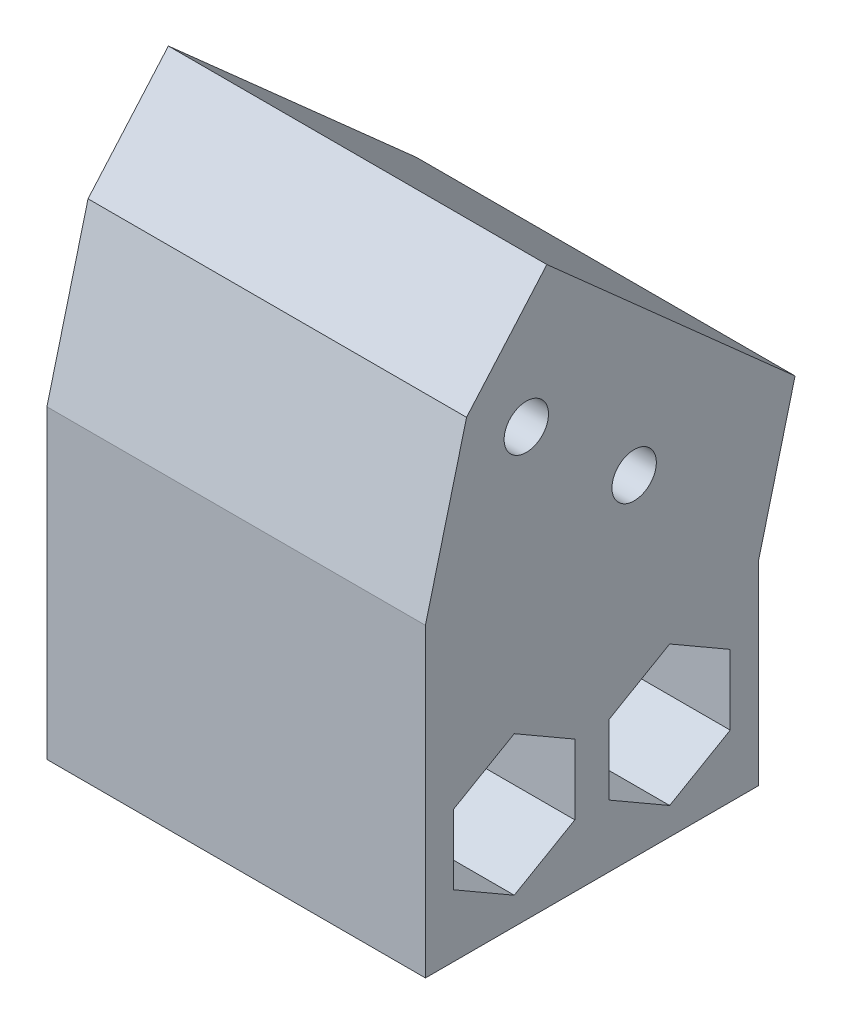
ISO-10303-21;
HEADER;
FILE_DESCRIPTION(('STEP AP214'),'2;1');
FILE_NAME('part.step','',(''),(''),'','','');
FILE_SCHEMA(('AUTOMOTIVE_DESIGN { 1 0 10303 214 1 1 1 1 }'));
ENDSEC;
DATA;
#1=APPLICATION_CONTEXT('core data for automotive mechanical design processes');
#2=APPLICATION_PROTOCOL_DEFINITION('international standard','automotive_design',2000,#1);
#3=PRODUCT_CONTEXT('',#1,'mechanical');
#4=PRODUCT('Part','Part','',(#3));
#5=PRODUCT_RELATED_PRODUCT_CATEGORY('part','',(#4));
#6=PRODUCT_DEFINITION_FORMATION('','',#4);
#7=PRODUCT_DEFINITION_CONTEXT('part definition',#1,'design');
#8=PRODUCT_DEFINITION('design','',#6,#7);
#9=PRODUCT_DEFINITION_SHAPE('','',#8);
#10=(LENGTH_UNIT() NAMED_UNIT(*) SI_UNIT(.MILLI.,.METRE.));
#11=(NAMED_UNIT(*) PLANE_ANGLE_UNIT() SI_UNIT($,.RADIAN.));
#12=(NAMED_UNIT(*) SI_UNIT($,.STERADIAN.) SOLID_ANGLE_UNIT());
#13=UNCERTAINTY_MEASURE_WITH_UNIT(LENGTH_MEASURE(1.E-05),#10,'distance_accuracy_value','');
#14=(GEOMETRIC_REPRESENTATION_CONTEXT(3) GLOBAL_UNCERTAINTY_ASSIGNED_CONTEXT((#13)) GLOBAL_UNIT_ASSIGNED_CONTEXT((#10,
#11,#12)) REPRESENTATION_CONTEXT('',''));
#15=CARTESIAN_POINT('',(0.,0.,0.));
#16=DIRECTION('',(0.,0.,1.));
#17=DIRECTION('',(1.,0.,0.));
#18=AXIS2_PLACEMENT_3D('',#15,#16,#17);
#19=CARTESIAN_POINT('',(0.,6.38000180263645,3.50000002822892));
#20=DIRECTION('',(1.,0.,0.));
#21=DIRECTION('',(0.,0.,-1.));
#22=AXIS2_PLACEMENT_3D('',#19,#20,#21);
#23=CYLINDRICAL_SURFACE('',#22,1.41101670903131);
#24=CARTESIAN_POINT('',(0.,6.38000180263645,3.50000002822892));
#25=DIRECTION('',(1.,0.,0.));
#26=DIRECTION('',(0.,0.,-1.));
#27=AXIS2_PLACEMENT_3D('',#24,#25,#26);
#28=CIRCLE('',#27,1.41101670903131);
#29=CARTESIAN_POINT('',(0.,6.38000180263645,2.08898331919762));
#30=VERTEX_POINT('',#29);
#31=EDGE_CURVE('E296',#30,#30,#28,.T.);
#32=ORIENTED_EDGE('',*,*,#31,.F.);
#33=EDGE_LOOP('',(#32));
#34=FACE_BOUND('',#33,.T.);
#35=CARTESIAN_POINT('',(7.05,6.38000180263645,3.50000002822892));
#36=DIRECTION('',(1.,0.,0.));
#37=DIRECTION('',(0.,0.,-1.));
#38=AXIS2_PLACEMENT_3D('',#35,#36,#37);
#39=CIRCLE('',#38,1.41101670903131);
#40=CARTESIAN_POINT('',(7.05,6.38000180263645,2.08898331919762));
#41=VERTEX_POINT('',#40);
#42=EDGE_CURVE('E231',#41,#41,#39,.F.);
#43=ORIENTED_EDGE('',*,*,#42,.F.);
#44=EDGE_LOOP('',(#43));
#45=FACE_BOUND('',#44,.T.);
#46=ADVANCED_FACE('F41',(#34,#45),#23,.F.);
#47=CARTESIAN_POINT('',(17.05,0.,0.));
#48=DIRECTION('',(-1.,0.,0.));
#49=DIRECTION('',(0.,0.,1.));
#50=AXIS2_PLACEMENT_3D('',#47,#48,#49);
#51=PLANE('',#50);
#52=DIRECTION('',(0.,0.5,-0.866025403784438));
#53=VECTOR('',#52,1.);
#54=CARTESIAN_POINT('',(17.05,3.23000180263645,3.50000002822892));
#55=LINE('',#54,#53);
#56=CARTESIAN_POINT('',(17.05,3.23000180263645,3.50000002822892));
#57=VERTEX_POINT('',#56);
#58=CARTESIAN_POINT('',(17.05,4.80500180263645,0.772020006307938));
#59=VERTEX_POINT('',#58);
#60=EDGE_CURVE('E219',#57,#59,#55,.T.);
#61=ORIENTED_EDGE('',*,*,#60,.F.);
#62=DIRECTION('',(0.,-0.5,-0.866025403784438));
#63=VECTOR('',#62,1.);
#64=CARTESIAN_POINT('',(17.05,4.80500180263645,6.22798005014991));
#65=LINE('',#64,#63);
#66=CARTESIAN_POINT('',(17.05,4.80500180263645,6.22798005014991));
#67=VERTEX_POINT('',#66);
#68=EDGE_CURVE('E59',#67,#57,#65,.T.);
#69=ORIENTED_EDGE('',*,*,#68,.F.);
#70=DIRECTION('',(0.,-1.,0.));
#71=VECTOR('',#70,1.);
#72=CARTESIAN_POINT('',(17.05,7.95500180263645,6.22798005014991));
#73=LINE('',#72,#71);
#74=CARTESIAN_POINT('',(17.05,7.95500180263645,6.22798005014991));
#75=VERTEX_POINT('',#74);
#76=EDGE_CURVE('E205',#75,#67,#73,.T.);
#77=ORIENTED_EDGE('',*,*,#76,.F.);
#78=DIRECTION('',(0.,-0.5,0.866025403784439));
#79=VECTOR('',#78,1.);
#80=CARTESIAN_POINT('',(17.05,9.53000180263646,3.50000002822892));
#81=LINE('',#80,#79);
#82=CARTESIAN_POINT('',(17.05,9.53000180263646,3.50000002822892));
#83=VERTEX_POINT('',#82);
#84=EDGE_CURVE('E208',#83,#75,#81,.T.);
#85=ORIENTED_EDGE('',*,*,#84,.F.);
#86=DIRECTION('',(0.,0.5,0.866025403784439));
#87=VECTOR('',#86,1.);
#88=CARTESIAN_POINT('',(17.05,7.95500180263646,0.772020006307939));
#89=LINE('',#88,#87);
#90=CARTESIAN_POINT('',(17.05,7.95500180263646,0.772020006307939));
#91=VERTEX_POINT('',#90);
#92=EDGE_CURVE('E224',#91,#83,#89,.T.);
#93=ORIENTED_EDGE('',*,*,#92,.F.);
#94=DIRECTION('',(0.,1.,0.));
#95=VECTOR('',#94,1.);
#96=CARTESIAN_POINT('',(17.05,4.80500180263645,0.772020006307938));
#97=LINE('',#96,#95);
#98=EDGE_CURVE('E221',#59,#91,#97,.T.);
#99=ORIENTED_EDGE('',*,*,#98,.F.);
#100=EDGE_LOOP('',(#61,#69,#77,#85,#93,#99));
#101=FACE_BOUND('',#100,.T.);
#102=DIRECTION('',(0.,0.499999999999999,0.866025403784439));
#103=VECTOR('',#102,1.);
#104=CARTESIAN_POINT('',(17.05,9.53000180263646,-3.50000002822892));
#105=LINE('',#104,#103);
#106=CARTESIAN_POINT('',(17.05,7.95500180263646,-6.22798005014991));
#107=VERTEX_POINT('',#106);
#108=CARTESIAN_POINT('',(17.05,9.53000180263646,-3.50000002822892));
#109=VERTEX_POINT('',#108);
#110=EDGE_CURVE('E265',#107,#109,#105,.T.);
#111=ORIENTED_EDGE('',*,*,#110,.F.);
#112=DIRECTION('',(0.,1.,0.));
#113=VECTOR('',#112,1.);
#114=CARTESIAN_POINT('',(17.05,7.95500180263646,-6.22798005014991));
#115=LINE('',#114,#113);
#116=CARTESIAN_POINT('',(17.05,4.80500180263645,-6.22798005014991));
#117=VERTEX_POINT('',#116);
#118=EDGE_CURVE('E67',#117,#107,#115,.T.);
#119=ORIENTED_EDGE('',*,*,#118,.F.);
#120=DIRECTION('',(0.,0.5,-0.866025403784438));
#121=VECTOR('',#120,1.);
#122=CARTESIAN_POINT('',(17.05,4.80500180263645,-6.22798005014991));
#123=LINE('',#122,#121);
#124=CARTESIAN_POINT('',(17.05,3.23000180263645,-3.50000002822892));
#125=VERTEX_POINT('',#124);
#126=EDGE_CURVE('E252',#125,#117,#123,.T.);
#127=ORIENTED_EDGE('',*,*,#126,.F.);
#128=DIRECTION('',(0.,-0.5,-0.866025403784439));
#129=VECTOR('',#128,1.);
#130=CARTESIAN_POINT('',(17.05,3.23000180263645,-3.50000002822892));
#131=LINE('',#130,#129);
#132=CARTESIAN_POINT('',(17.05,4.80500180263645,-0.772020006307939));
#133=VERTEX_POINT('',#132);
#134=EDGE_CURVE('E255',#133,#125,#131,.T.);
#135=ORIENTED_EDGE('',*,*,#134,.F.);
#136=DIRECTION('',(0.,-1.,0.));
#137=VECTOR('',#136,1.);
#138=CARTESIAN_POINT('',(17.05,4.80500180263645,-0.772020006307939));
#139=LINE('',#138,#137);
#140=CARTESIAN_POINT('',(17.05,7.95500180263646,-0.772020006307938));
#141=VERTEX_POINT('',#140);
#142=EDGE_CURVE('E259',#141,#133,#139,.T.);
#143=ORIENTED_EDGE('',*,*,#142,.F.);
#144=DIRECTION('',(0.,-0.5,0.866025403784439));
#145=VECTOR('',#144,1.);
#146=CARTESIAN_POINT('',(17.05,7.95500180263646,-0.772020006307938));
#147=LINE('',#146,#145);
#148=EDGE_CURVE('E262',#109,#141,#147,.T.);
#149=ORIENTED_EDGE('',*,*,#148,.F.);
#150=EDGE_LOOP('',(#111,#119,#127,#135,#143,#149));
#151=FACE_BOUND('',#150,.T.);
#152=CARTESIAN_POINT('',(17.05,16.9134965392068,-1.90105289318811));
#153=DIRECTION('',(1.,0.,0.));
#154=DIRECTION('',(0.,0.,-1.));
#155=AXIS2_PLACEMENT_3D('',#152,#153,#154);
#156=CIRCLE('',#155,1.);
#157=CARTESIAN_POINT('',(17.05,16.9134965392068,-2.90105289318811));
#158=VERTEX_POINT('',#157);
#159=EDGE_CURVE('E302',#158,#158,#156,.T.);
#160=ORIENTED_EDGE('',*,*,#159,.F.);
#161=EDGE_LOOP('',(#160));
#162=FACE_BOUND('',#161,.T.);
#163=CARTESIAN_POINT('',(17.05,21.2314292789877,2.95749183283099));
#164=DIRECTION('',(1.,0.,0.));
#165=DIRECTION('',(0.,0.,-1.));
#166=AXIS2_PLACEMENT_3D('',#163,#164,#165);
#167=CIRCLE('',#166,1.);
#168=CARTESIAN_POINT('',(17.05,21.2314292789877,1.95749183283099));
#169=VERTEX_POINT('',#168);
#170=EDGE_CURVE('E309',#169,#169,#167,.T.);
#171=ORIENTED_EDGE('',*,*,#170,.F.);
#172=EDGE_LOOP('',(#171));
#173=FACE_BOUND('',#172,.T.);
#174=DIRECTION('',(0.,-0.753830308734117,0.657069148289453));
#175=VECTOR('',#174,1.);
#176=CARTESIAN_POINT('',(17.05,27.0965313966701,2.03016403967647));
#177=LINE('',#176,#175);
#178=CARTESIAN_POINT('',(17.05,27.0965313966701,2.03016403967647));
#179=VERTEX_POINT('',#178);
#180=CARTESIAN_POINT('',(17.05,22.9454674644235,5.64840014779558));
#181=VERTEX_POINT('',#180);
#182=EDGE_CURVE('E288',#179,#181,#177,.T.);
#183=ORIENTED_EDGE('',*,*,#182,.T.);
#184=DIRECTION('',(0.,-0.968365769479699,0.249535040625543));
#185=VECTOR('',#184,1.);
#186=CARTESIAN_POINT('',(17.05,15.76,7.5));
#187=LINE('',#186,#185);
#188=CARTESIAN_POINT('',(17.05,15.76,7.5));
#189=VERTEX_POINT('',#188);
#190=EDGE_CURVE('E315',#181,#189,#187,.T.);
#191=ORIENTED_EDGE('',*,*,#190,.T.);
#192=DIRECTION('',(0.,-1.,0.));
#193=VECTOR('',#192,1.);
#194=CARTESIAN_POINT('',(17.05,0.,7.5));
#195=LINE('',#194,#193);
#196=CARTESIAN_POINT('',(17.05,2.,7.5));
#197=VERTEX_POINT('',#196);
#198=EDGE_CURVE('E317',#189,#197,#195,.T.);
#199=ORIENTED_EDGE('',*,*,#198,.T.);
#200=DIRECTION('',(0.,0.,-1.));
#201=VECTOR('',#200,1.);
#202=CARTESIAN_POINT('',(17.05,2.,0.));
#203=LINE('',#202,#201);
#204=CARTESIAN_POINT('',(17.05,2.,-7.5));
#205=VERTEX_POINT('',#204);
#206=EDGE_CURVE('E51',#197,#205,#203,.T.);
#207=ORIENTED_EDGE('',*,*,#206,.T.);
#208=DIRECTION('',(0.,1.,0.));
#209=VECTOR('',#208,1.);
#210=CARTESIAN_POINT('',(17.05,0.,-7.5));
#211=LINE('',#210,#209);
#212=CARTESIAN_POINT('',(17.05,10.76,-7.5));
#213=VERTEX_POINT('',#212);
#214=EDGE_CURVE('E321',#205,#213,#211,.T.);
#215=ORIENTED_EDGE('',*,*,#214,.T.);
#216=DIRECTION('',(0.,0.968365769479699,-0.249535040625543));
#217=VECTOR('',#216,1.);
#218=CARTESIAN_POINT('',(17.05,10.76,-7.5));
#219=LINE('',#218,#217);
#220=CARTESIAN_POINT('',(17.05,17.1608977362608,-9.14942661853483));
#221=VERTEX_POINT('',#220);
#222=EDGE_CURVE('E323',#213,#221,#219,.T.);
#223=ORIENTED_EDGE('',*,*,#222,.T.);
#224=DIRECTION('',(0.,0.66429734458168,0.747468419387554));
#225=VECTOR('',#224,1.);
#226=CARTESIAN_POINT('',(17.05,28.9394581226187,4.10382809708637));
#227=LINE('',#226,#225);
#228=EDGE_CURVE('E325',#221,#179,#227,.T.);
#229=ORIENTED_EDGE('',*,*,#228,.T.);
#230=EDGE_LOOP('',(#183,#191,#199,#207,#215,#223,#229));
#231=FACE_BOUND('',#230,.T.);
#232=ADVANCED_FACE('F387',(#101,#151,#162,#173,#231),#51,.F.);
#233=CARTESIAN_POINT('',(0.,0.,0.));
#234=DIRECTION('',(-1.,0.,0.));
#235=DIRECTION('',(0.,0.,1.));
#236=AXIS2_PLACEMENT_3D('',#233,#234,#235);
#237=PLANE('',#236);
#238=ORIENTED_EDGE('',*,*,#31,.T.);
#239=EDGE_LOOP('',(#238));
#240=FACE_BOUND('',#239,.T.);
#241=CARTESIAN_POINT('',(0.,6.38000184775111,-3.5));
#242=DIRECTION('',(1.,0.,0.));
#243=DIRECTION('',(0.,0.,-1.));
#244=AXIS2_PLACEMENT_3D('',#241,#242,#243);
#245=CIRCLE('',#244,1.41101670903139);
#246=CARTESIAN_POINT('',(0.,6.38000184775111,-4.91101670903139));
#247=VERTEX_POINT('',#246);
#248=EDGE_CURVE('E295',#247,#247,#245,.T.);
#249=ORIENTED_EDGE('',*,*,#248,.T.);
#250=EDGE_LOOP('',(#249));
#251=FACE_BOUND('',#250,.T.);
#252=CARTESIAN_POINT('',(0.,21.2314292789877,2.95749183283099));
#253=DIRECTION('',(1.,0.,0.));
#254=DIRECTION('',(0.,0.,-1.));
#255=AXIS2_PLACEMENT_3D('',#252,#253,#254);
#256=CIRCLE('',#255,1.);
#257=CARTESIAN_POINT('',(0.,21.2314292789877,1.95749183283099));
#258=VERTEX_POINT('',#257);
#259=EDGE_CURVE('E305',#258,#258,#256,.T.);
#260=ORIENTED_EDGE('',*,*,#259,.T.);
#261=EDGE_LOOP('',(#260));
#262=FACE_BOUND('',#261,.T.);
#263=CARTESIAN_POINT('',(0.,16.9134965392068,-1.90105289318811));
#264=DIRECTION('',(1.,0.,0.));
#265=DIRECTION('',(0.,0.,-1.));
#266=AXIS2_PLACEMENT_3D('',#263,#264,#265);
#267=CIRCLE('',#266,1.);
#268=CARTESIAN_POINT('',(0.,16.9134965392068,-2.90105289318811));
#269=VERTEX_POINT('',#268);
#270=EDGE_CURVE('E306',#269,#269,#267,.T.);
#271=ORIENTED_EDGE('',*,*,#270,.T.);
#272=EDGE_LOOP('',(#271));
#273=FACE_BOUND('',#272,.T.);
#274=DIRECTION('',(0.,-0.968365769479699,0.249535040625543));
#275=VECTOR('',#274,1.);
#276=CARTESIAN_POINT('',(0.,15.76,7.5));
#277=LINE('',#276,#275);
#278=CARTESIAN_POINT('',(0.,22.9454674644235,5.64840014779558));
#279=VERTEX_POINT('',#278);
#280=CARTESIAN_POINT('',(0.,15.76,7.5));
#281=VERTEX_POINT('',#280);
#282=EDGE_CURVE('E312',#279,#281,#277,.T.);
#283=ORIENTED_EDGE('',*,*,#282,.F.);
#284=DIRECTION('',(0.,-0.753830308734117,0.657069148289453));
#285=VECTOR('',#284,1.);
#286=CARTESIAN_POINT('',(0.,27.0965313966701,2.03016403967647));
#287=LINE('',#286,#285);
#288=CARTESIAN_POINT('',(0.,27.0965313966701,2.03016403967647));
#289=VERTEX_POINT('',#288);
#290=EDGE_CURVE('E285',#289,#279,#287,.T.);
#291=ORIENTED_EDGE('',*,*,#290,.F.);
#292=DIRECTION('',(0.,0.66429734458168,0.747468419387554));
#293=VECTOR('',#292,1.);
#294=CARTESIAN_POINT('',(0.,28.9394581226187,4.10382809708637));
#295=LINE('',#294,#293);
#296=CARTESIAN_POINT('',(0.,17.1608977362608,-9.14942661853483));
#297=VERTEX_POINT('',#296);
#298=EDGE_CURVE('E318',#297,#289,#295,.T.);
#299=ORIENTED_EDGE('',*,*,#298,.F.);
#300=DIRECTION('',(0.,0.968365769479699,-0.249535040625543));
#301=VECTOR('',#300,1.);
#302=CARTESIAN_POINT('',(0.,10.76,-7.5));
#303=LINE('',#302,#301);
#304=CARTESIAN_POINT('',(0.,10.76,-7.5));
#305=VERTEX_POINT('',#304);
#306=EDGE_CURVE('E338',#305,#297,#303,.T.);
#307=ORIENTED_EDGE('',*,*,#306,.F.);
#308=DIRECTION('',(0.,1.,0.));
#309=VECTOR('',#308,1.);
#310=CARTESIAN_POINT('',(0.,0.,-7.5));
#311=LINE('',#310,#309);
#312=CARTESIAN_POINT('',(0.,0.,-7.5));
#313=VERTEX_POINT('',#312);
#314=EDGE_CURVE('E336',#313,#305,#311,.T.);
#315=ORIENTED_EDGE('',*,*,#314,.F.);
#316=DIRECTION('',(0.,0.,-1.));
#317=VECTOR('',#316,1.);
#318=CARTESIAN_POINT('',(0.,0.,7.5));
#319=LINE('',#318,#317);
#320=CARTESIAN_POINT('',(0.,0.,5.5));
#321=VERTEX_POINT('',#320);
#322=EDGE_CURVE('E333',#321,#313,#319,.T.);
#323=ORIENTED_EDGE('',*,*,#322,.F.);
#324=DIRECTION('',(0.,-0.707106781186547,-0.707106781186548));
#325=VECTOR('',#324,1.);
#326=CARTESIAN_POINT('',(0.,-2.75,2.74999999999999));
#327=LINE('',#326,#325);
#328=CARTESIAN_POINT('',(0.,2.,7.5));
#329=VERTEX_POINT('',#328);
#330=EDGE_CURVE('E357',#321,#329,#327,.F.);
#331=ORIENTED_EDGE('',*,*,#330,.T.);
#332=DIRECTION('',(0.,-1.,0.));
#333=VECTOR('',#332,1.);
#334=CARTESIAN_POINT('',(0.,0.,7.5));
#335=LINE('',#334,#333);
#336=EDGE_CURVE('E330',#281,#329,#335,.T.);
#337=ORIENTED_EDGE('',*,*,#336,.F.);
#338=EDGE_LOOP('',(#283,#291,#299,#307,#315,#323,#331,#337));
#339=FACE_BOUND('',#338,.T.);
#340=ADVANCED_FACE('F394',(#240,#251,#262,#273,#339),#237,.T.);
#341=CARTESIAN_POINT('',(17.05,15.76,7.5));
#342=DIRECTION('',(0.,-0.249535040625543,-0.968365769479699));
#343=DIRECTION('',(0.,0.968365769479699,-0.249535040625543));
#344=AXIS2_PLACEMENT_3D('',#341,#342,#343);
#345=PLANE('',#344);
#346=DIRECTION('',(1.,0.,0.));
#347=VECTOR('',#346,1.);
#348=CARTESIAN_POINT('',(0.,22.9454674644235,5.64840014779558));
#349=LINE('',#348,#347);
#350=EDGE_CURVE('E293',#279,#181,#349,.T.);
#351=ORIENTED_EDGE('',*,*,#350,.F.);
#352=ORIENTED_EDGE('',*,*,#282,.T.);
#353=DIRECTION('',(-1.,0.,0.));
#354=VECTOR('',#353,1.);
#355=CARTESIAN_POINT('',(17.05,15.76,7.5));
#356=LINE('',#355,#354);
#357=EDGE_CURVE('E349',#189,#281,#356,.T.);
#358=ORIENTED_EDGE('',*,*,#357,.F.);
#359=ORIENTED_EDGE('',*,*,#190,.F.);
#360=EDGE_LOOP('',(#351,#352,#358,#359));
#361=FACE_BOUND('',#360,.T.);
#362=ADVANCED_FACE('F415',(#361),#345,.F.);
#363=CARTESIAN_POINT('',(17.05,28.9394581226187,4.10382809708637));
#364=DIRECTION('',(0.,-0.747468419387554,0.66429734458168));
#365=DIRECTION('',(0.,-0.66429734458168,-0.747468419387554));
#366=AXIS2_PLACEMENT_3D('',#363,#364,#365);
#367=PLANE('',#366);
#368=DIRECTION('',(1.,0.,0.));
#369=VECTOR('',#368,1.);
#370=CARTESIAN_POINT('',(0.,27.0965313966701,2.03016403967647));
#371=LINE('',#370,#369);
#372=EDGE_CURVE('E287',#289,#179,#371,.T.);
#373=ORIENTED_EDGE('',*,*,#372,.T.);
#374=ORIENTED_EDGE('',*,*,#228,.F.);
#375=DIRECTION('',(-1.,0.,0.));
#376=VECTOR('',#375,1.);
#377=CARTESIAN_POINT('',(17.05,17.1608977362608,-9.14942661853483));
#378=LINE('',#377,#376);
#379=EDGE_CURVE('E328',#221,#297,#378,.T.);
#380=ORIENTED_EDGE('',*,*,#379,.T.);
#381=ORIENTED_EDGE('',*,*,#298,.T.);
#382=EDGE_LOOP('',(#373,#374,#380,#381));
#383=FACE_BOUND('',#382,.T.);
#384=ADVANCED_FACE('F417',(#383),#367,.F.);
#385=CARTESIAN_POINT('',(17.05,0.,7.5));
#386=DIRECTION('',(0.,0.,-1.));
#387=DIRECTION('',(-1.,0.,0.));
#388=AXIS2_PLACEMENT_3D('',#385,#386,#387);
#389=PLANE('',#388);
#390=ORIENTED_EDGE('',*,*,#336,.T.);
#391=DIRECTION('',(1.,0.,0.));
#392=VECTOR('',#391,1.);
#393=CARTESIAN_POINT('',(17.05,2.,7.5));
#394=LINE('',#393,#392);
#395=EDGE_CURVE('E359',#329,#197,#394,.T.);
#396=ORIENTED_EDGE('',*,*,#395,.T.);
#397=ORIENTED_EDGE('',*,*,#198,.F.);
#398=ORIENTED_EDGE('',*,*,#357,.T.);
#399=EDGE_LOOP('',(#390,#396,#397,#398));
#400=FACE_BOUND('',#399,.T.);
#401=ADVANCED_FACE('F420',(#400),#389,.F.);
#402=CARTESIAN_POINT('',(17.05,0.,7.5));
#403=DIRECTION('',(0.,1.,0.));
#404=DIRECTION('',(0.,0.,1.));
#405=AXIS2_PLACEMENT_3D('',#402,#403,#404);
#406=PLANE('',#405);
#407=DIRECTION('',(0.,0.,1.));
#408=VECTOR('',#407,1.);
#409=CARTESIAN_POINT('',(15.05,0.,7.5));
#410=LINE('',#409,#408);
#411=CARTESIAN_POINT('',(15.05,0.,-7.5));
#412=VERTEX_POINT('',#411);
#413=CARTESIAN_POINT('',(15.05,0.,5.5));
#414=VERTEX_POINT('',#413);
#415=EDGE_CURVE('E352',#412,#414,#410,.T.);
#416=ORIENTED_EDGE('',*,*,#415,.T.);
#417=DIRECTION('',(-1.,0.,0.));
#418=VECTOR('',#417,1.);
#419=CARTESIAN_POINT('',(17.05,0.,5.5));
#420=LINE('',#419,#418);
#421=EDGE_CURVE('E354',#414,#321,#420,.T.);
#422=ORIENTED_EDGE('',*,*,#421,.T.);
#423=ORIENTED_EDGE('',*,*,#322,.T.);
#424=DIRECTION('',(-1.,0.,0.));
#425=VECTOR('',#424,1.);
#426=CARTESIAN_POINT('',(17.05,0.,-7.5));
#427=LINE('',#426,#425);
#428=EDGE_CURVE('E347',#412,#313,#427,.T.);
#429=ORIENTED_EDGE('',*,*,#428,.F.);
#430=EDGE_LOOP('',(#416,#422,#423,#429));
#431=FACE_BOUND('',#430,.T.);
#432=ADVANCED_FACE('F428',(#431),#406,.F.);
#433=CARTESIAN_POINT('',(17.05,0.,-7.5));
#434=DIRECTION('',(0.,0.,1.));
#435=DIRECTION('',(1.,0.,0.));
#436=AXIS2_PLACEMENT_3D('',#433,#434,#435);
#437=PLANE('',#436);
#438=ORIENTED_EDGE('',*,*,#214,.F.);
#439=DIRECTION('',(0.707106781186548,0.707106781186547,0.));
#440=VECTOR('',#439,1.);
#441=CARTESIAN_POINT('',(17.05,2.,-7.5));
#442=LINE('',#441,#440);
#443=EDGE_CURVE('E11',#205,#412,#442,.F.);
#444=ORIENTED_EDGE('',*,*,#443,.T.);
#445=ORIENTED_EDGE('',*,*,#428,.T.);
#446=ORIENTED_EDGE('',*,*,#314,.T.);
#447=DIRECTION('',(-1.,0.,0.));
#448=VECTOR('',#447,1.);
#449=CARTESIAN_POINT('',(17.05,10.76,-7.5));
#450=LINE('',#449,#448);
#451=EDGE_CURVE('E344',#213,#305,#450,.T.);
#452=ORIENTED_EDGE('',*,*,#451,.F.);
#453=EDGE_LOOP('',(#438,#444,#445,#446,#452));
#454=FACE_BOUND('',#453,.T.);
#455=ADVANCED_FACE('F424',(#454),#437,.F.);
#456=CARTESIAN_POINT('',(17.05,10.76,-7.5));
#457=DIRECTION('',(0.,0.249535040625543,0.968365769479699));
#458=DIRECTION('',(0.,-0.968365769479699,0.249535040625543));
#459=AXIS2_PLACEMENT_3D('',#456,#457,#458);
#460=PLANE('',#459);
#461=ORIENTED_EDGE('',*,*,#306,.T.);
#462=ORIENTED_EDGE('',*,*,#379,.F.);
#463=ORIENTED_EDGE('',*,*,#222,.F.);
#464=ORIENTED_EDGE('',*,*,#451,.T.);
#465=EDGE_LOOP('',(#461,#462,#463,#464));
#466=FACE_BOUND('',#465,.T.);
#467=ADVANCED_FACE('F410',(#466),#460,.F.);
#468=CARTESIAN_POINT('',(17.05,21.2314292789877,2.95749183283099));
#469=DIRECTION('',(-1.,0.,0.));
#470=DIRECTION('',(0.,0.,1.));
#471=AXIS2_PLACEMENT_3D('',#468,#469,#470);
#472=CYLINDRICAL_SURFACE('',#471,1.);
#473=ORIENTED_EDGE('',*,*,#170,.T.);
#474=EDGE_LOOP('',(#473));
#475=FACE_BOUND('',#474,.T.);
#476=ORIENTED_EDGE('',*,*,#259,.F.);
#477=EDGE_LOOP('',(#476));
#478=FACE_BOUND('',#477,.T.);
#479=ADVANCED_FACE('F407',(#475,#478),#472,.F.);
#480=CARTESIAN_POINT('',(17.05,16.9134965392068,-1.90105289318811));
#481=DIRECTION('',(-1.,0.,0.));
#482=DIRECTION('',(0.,0.,1.));
#483=AXIS2_PLACEMENT_3D('',#480,#481,#482);
#484=CYLINDRICAL_SURFACE('',#483,1.);
#485=ORIENTED_EDGE('',*,*,#159,.T.);
#486=EDGE_LOOP('',(#485));
#487=FACE_BOUND('',#486,.T.);
#488=ORIENTED_EDGE('',*,*,#270,.F.);
#489=EDGE_LOOP('',(#488));
#490=FACE_BOUND('',#489,.T.);
#491=ADVANCED_FACE('F404',(#487,#490),#484,.F.);
#492=CARTESIAN_POINT('',(17.05,2.,0.));
#493=DIRECTION('',(-0.707106781186547,0.707106781186548,0.));
#494=DIRECTION('',(0.,0.,-1.));
#495=AXIS2_PLACEMENT_3D('',#492,#493,#494);
#496=PLANE('',#495);
#497=ORIENTED_EDGE('',*,*,#443,.F.);
#498=ORIENTED_EDGE('',*,*,#206,.F.);
#499=DIRECTION('',(-0.577350269189626,-0.577350269189625,-0.577350269189626));
#500=VECTOR('',#499,1.);
#501=CARTESIAN_POINT('',(14.55,-0.5,4.99999999999999));
#502=LINE('',#501,#500);
#503=EDGE_CURVE('E299',#414,#197,#502,.F.);
#504=ORIENTED_EDGE('',*,*,#503,.F.);
#505=ORIENTED_EDGE('',*,*,#415,.F.);
#506=EDGE_LOOP('',(#497,#498,#504,#505));
#507=FACE_BOUND('',#506,.T.);
#508=ADVANCED_FACE('F44',(#507),#496,.F.);
#509=CARTESIAN_POINT('',(17.05,0.,5.5));
#510=DIRECTION('',(0.,0.707106781186548,-0.707106781186547));
#511=DIRECTION('',(-1.,0.,0.));
#512=AXIS2_PLACEMENT_3D('',#509,#510,#511);
#513=PLANE('',#512);
#514=ORIENTED_EDGE('',*,*,#503,.T.);
#515=ORIENTED_EDGE('',*,*,#395,.F.);
#516=ORIENTED_EDGE('',*,*,#330,.F.);
#517=ORIENTED_EDGE('',*,*,#421,.F.);
#518=EDGE_LOOP('',(#514,#515,#516,#517));
#519=FACE_BOUND('',#518,.T.);
#520=ADVANCED_FACE('F403',(#519),#513,.F.);
#521=CARTESIAN_POINT('',(0.,6.38000184775111,-3.5));
#522=DIRECTION('',(1.,0.,0.));
#523=DIRECTION('',(0.,0.,-1.));
#524=AXIS2_PLACEMENT_3D('',#521,#522,#523);
#525=CYLINDRICAL_SURFACE('',#524,1.41101670903139);
#526=CARTESIAN_POINT('',(7.05,6.38000184775111,-3.5));
#527=DIRECTION('',(-1.,0.,0.));
#528=DIRECTION('',(0.,0.,1.));
#529=AXIS2_PLACEMENT_3D('',#526,#527,#528);
#530=CIRCLE('',#529,1.41101670903139);
#531=CARTESIAN_POINT('',(7.05,6.38000184775111,-2.08898329096862));
#532=VERTEX_POINT('',#531);
#533=EDGE_CURVE('E46',#532,#532,#530,.F.);
#534=ORIENTED_EDGE('',*,*,#533,.T.);
#535=EDGE_LOOP('',(#534));
#536=FACE_BOUND('',#535,.T.);
#537=ORIENTED_EDGE('',*,*,#248,.F.);
#538=EDGE_LOOP('',(#537));
#539=FACE_BOUND('',#538,.T.);
#540=ADVANCED_FACE('F368',(#536,#539),#525,.F.);
#541=CARTESIAN_POINT('',(0.,27.0965313966701,2.03016403967647));
#542=DIRECTION('',(0.,0.657069148289453,0.753830308734117));
#543=DIRECTION('',(0.,-0.753830308734117,0.657069148289453));
#544=AXIS2_PLACEMENT_3D('',#541,#542,#543);
#545=PLANE('',#544);
#546=ORIENTED_EDGE('',*,*,#182,.F.);
#547=ORIENTED_EDGE('',*,*,#372,.F.);
#548=ORIENTED_EDGE('',*,*,#290,.T.);
#549=ORIENTED_EDGE('',*,*,#350,.T.);
#550=EDGE_LOOP('',(#546,#547,#548,#549));
#551=FACE_BOUND('',#550,.T.);
#552=ADVANCED_FACE('F400',(#551),#545,.T.);
#553=CARTESIAN_POINT('',(7.05,0.,0.));
#554=DIRECTION('',(1.,0.,0.));
#555=DIRECTION('',(0.,0.,-1.));
#556=AXIS2_PLACEMENT_3D('',#553,#554,#555);
#557=PLANE('',#556);
#558=DIRECTION('',(0.,-0.5,-0.866025403784438));
#559=VECTOR('',#558,1.);
#560=CARTESIAN_POINT('',(7.05,4.80500180263645,6.22798005014991));
#561=LINE('',#560,#559);
#562=CARTESIAN_POINT('',(7.05,4.80500180263645,6.22798005014991));
#563=VERTEX_POINT('',#562);
#564=CARTESIAN_POINT('',(7.05,3.23000180263645,3.50000002822892));
#565=VERTEX_POINT('',#564);
#566=EDGE_CURVE('E185',#563,#565,#561,.T.);
#567=ORIENTED_EDGE('',*,*,#566,.T.);
#568=DIRECTION('',(0.,0.5,-0.866025403784438));
#569=VECTOR('',#568,1.);
#570=CARTESIAN_POINT('',(7.05,3.23000180263645,3.50000002822892));
#571=LINE('',#570,#569);
#572=CARTESIAN_POINT('',(7.05,4.80500180263645,0.772020006307938));
#573=VERTEX_POINT('',#572);
#574=EDGE_CURVE('E194',#565,#573,#571,.T.);
#575=ORIENTED_EDGE('',*,*,#574,.T.);
#576=DIRECTION('',(0.,1.,0.));
#577=VECTOR('',#576,1.);
#578=CARTESIAN_POINT('',(7.05,4.80500180263645,0.772020006307938));
#579=LINE('',#578,#577);
#580=CARTESIAN_POINT('',(7.05,7.95500180263646,0.772020006307939));
#581=VERTEX_POINT('',#580);
#582=EDGE_CURVE('E199',#573,#581,#579,.T.);
#583=ORIENTED_EDGE('',*,*,#582,.T.);
#584=DIRECTION('',(0.,0.5,0.866025403784439));
#585=VECTOR('',#584,1.);
#586=CARTESIAN_POINT('',(7.05,7.95500180263646,0.772020006307939));
#587=LINE('',#586,#585);
#588=CARTESIAN_POINT('',(7.05,9.53000180263646,3.50000002822892));
#589=VERTEX_POINT('',#588);
#590=EDGE_CURVE('E212',#581,#589,#587,.T.);
#591=ORIENTED_EDGE('',*,*,#590,.T.);
#592=DIRECTION('',(0.,-0.5,0.866025403784439));
#593=VECTOR('',#592,1.);
#594=CARTESIAN_POINT('',(7.05,9.53000180263646,3.50000002822892));
#595=LINE('',#594,#593);
#596=CARTESIAN_POINT('',(7.05,7.95500180263645,6.22798005014991));
#597=VERTEX_POINT('',#596);
#598=EDGE_CURVE('E215',#589,#597,#595,.T.);
#599=ORIENTED_EDGE('',*,*,#598,.T.);
#600=DIRECTION('',(0.,-1.,0.));
#601=VECTOR('',#600,1.);
#602=CARTESIAN_POINT('',(7.05,7.95500180263645,6.22798005014991));
#603=LINE('',#602,#601);
#604=EDGE_CURVE('E191',#597,#563,#603,.T.);
#605=ORIENTED_EDGE('',*,*,#604,.T.);
#606=EDGE_LOOP('',(#567,#575,#583,#591,#599,#605));
#607=FACE_BOUND('',#606,.T.);
#608=ORIENTED_EDGE('',*,*,#42,.T.);
#609=EDGE_LOOP('',(#608));
#610=FACE_BOUND('',#609,.T.);
#611=ADVANCED_FACE('F201',(#607,#610),#557,.T.);
#612=CARTESIAN_POINT('',(7.05,4.80500180263645,6.22798005014991));
#613=DIRECTION('',(0.,-0.866025403784439,0.5));
#614=DIRECTION('',(0.,-0.5,-0.866025403784439));
#615=AXIS2_PLACEMENT_3D('',#612,#613,#614);
#616=PLANE('',#615);
#617=ORIENTED_EDGE('',*,*,#68,.T.);
#618=DIRECTION('',(1.,0.,0.));
#619=VECTOR('',#618,1.);
#620=CARTESIAN_POINT('',(7.05,3.23000180263645,3.50000002822892));
#621=LINE('',#620,#619);
#622=EDGE_CURVE('E181',#565,#57,#621,.T.);
#623=ORIENTED_EDGE('',*,*,#622,.F.);
#624=ORIENTED_EDGE('',*,*,#566,.F.);
#625=DIRECTION('',(1.,0.,0.));
#626=VECTOR('',#625,1.);
#627=CARTESIAN_POINT('',(7.05,4.80500180263645,6.22798005014991));
#628=LINE('',#627,#626);
#629=EDGE_CURVE('E229',#563,#67,#628,.T.);
#630=ORIENTED_EDGE('',*,*,#629,.T.);
#631=EDGE_LOOP('',(#617,#623,#624,#630));
#632=FACE_BOUND('',#631,.T.);
#633=ADVANCED_FACE('F183',(#632),#616,.F.);
#634=CARTESIAN_POINT('',(7.05,7.95500180263645,6.22798005014991));
#635=DIRECTION('',(0.,0.,1.));
#636=DIRECTION('',(1.,0.,0.));
#637=AXIS2_PLACEMENT_3D('',#634,#635,#636);
#638=PLANE('',#637);
#639=ORIENTED_EDGE('',*,*,#76,.T.);
#640=ORIENTED_EDGE('',*,*,#629,.F.);
#641=ORIENTED_EDGE('',*,*,#604,.F.);
#642=DIRECTION('',(1.,0.,0.));
#643=VECTOR('',#642,1.);
#644=CARTESIAN_POINT('',(7.05,7.95500180263645,6.22798005014991));
#645=LINE('',#644,#643);
#646=EDGE_CURVE('E232',#597,#75,#645,.T.);
#647=ORIENTED_EDGE('',*,*,#646,.T.);
#648=EDGE_LOOP('',(#639,#640,#641,#647));
#649=FACE_BOUND('',#648,.T.);
#650=ADVANCED_FACE('F480',(#649),#638,.F.);
#651=CARTESIAN_POINT('',(7.05,9.53000180263646,3.50000002822892));
#652=DIRECTION('',(0.,0.866025403784439,0.5));
#653=DIRECTION('',(0.,-0.5,0.866025403784439));
#654=AXIS2_PLACEMENT_3D('',#651,#652,#653);
#655=PLANE('',#654);
#656=ORIENTED_EDGE('',*,*,#84,.T.);
#657=ORIENTED_EDGE('',*,*,#646,.F.);
#658=ORIENTED_EDGE('',*,*,#598,.F.);
#659=DIRECTION('',(1.,0.,0.));
#660=VECTOR('',#659,1.);
#661=CARTESIAN_POINT('',(7.05,9.53000180263646,3.50000002822892));
#662=LINE('',#661,#660);
#663=EDGE_CURVE('E234',#589,#83,#662,.T.);
#664=ORIENTED_EDGE('',*,*,#663,.T.);
#665=EDGE_LOOP('',(#656,#657,#658,#664));
#666=FACE_BOUND('',#665,.T.);
#667=ADVANCED_FACE('F485',(#666),#655,.F.);
#668=CARTESIAN_POINT('',(7.05,7.95500180263646,0.772020006307939));
#669=DIRECTION('',(0.,0.866025403784439,-0.5));
#670=DIRECTION('',(0.,0.5,0.866025403784439));
#671=AXIS2_PLACEMENT_3D('',#668,#669,#670);
#672=PLANE('',#671);
#673=ORIENTED_EDGE('',*,*,#92,.T.);
#674=ORIENTED_EDGE('',*,*,#663,.F.);
#675=ORIENTED_EDGE('',*,*,#590,.F.);
#676=DIRECTION('',(1.,0.,0.));
#677=VECTOR('',#676,1.);
#678=CARTESIAN_POINT('',(7.05,7.95500180263646,0.772020006307939));
#679=LINE('',#678,#677);
#680=EDGE_CURVE('E236',#581,#91,#679,.T.);
#681=ORIENTED_EDGE('',*,*,#680,.T.);
#682=EDGE_LOOP('',(#673,#674,#675,#681));
#683=FACE_BOUND('',#682,.T.);
#684=ADVANCED_FACE('F489',(#683),#672,.F.);
#685=CARTESIAN_POINT('',(7.05,4.80500180263645,0.772020006307938));
#686=DIRECTION('',(0.,0.,-1.));
#687=DIRECTION('',(0.,1.,0.));
#688=AXIS2_PLACEMENT_3D('',#685,#686,#687);
#689=PLANE('',#688);
#690=ORIENTED_EDGE('',*,*,#98,.T.);
#691=ORIENTED_EDGE('',*,*,#680,.F.);
#692=ORIENTED_EDGE('',*,*,#582,.F.);
#693=DIRECTION('',(1.,0.,0.));
#694=VECTOR('',#693,1.);
#695=CARTESIAN_POINT('',(7.05,4.80500180263645,0.772020006307938));
#696=LINE('',#695,#694);
#697=EDGE_CURVE('E190',#573,#59,#696,.T.);
#698=ORIENTED_EDGE('',*,*,#697,.T.);
#699=EDGE_LOOP('',(#690,#691,#692,#698));
#700=FACE_BOUND('',#699,.T.);
#701=ADVANCED_FACE('F382',(#700),#689,.F.);
#702=CARTESIAN_POINT('',(7.05,3.23000180263645,3.50000002822892));
#703=DIRECTION('',(0.,-0.866025403784439,-0.5));
#704=DIRECTION('',(0.,0.5,-0.866025403784439));
#705=AXIS2_PLACEMENT_3D('',#702,#703,#704);
#706=PLANE('',#705);
#707=ORIENTED_EDGE('',*,*,#60,.T.);
#708=ORIENTED_EDGE('',*,*,#697,.F.);
#709=ORIENTED_EDGE('',*,*,#574,.F.);
#710=ORIENTED_EDGE('',*,*,#622,.T.);
#711=EDGE_LOOP('',(#707,#708,#709,#710));
#712=FACE_BOUND('',#711,.T.);
#713=ADVANCED_FACE('F195',(#712),#706,.F.);
#714=CARTESIAN_POINT('',(7.05,0.,0.));
#715=DIRECTION('',(-1.,0.,0.));
#716=DIRECTION('',(0.,0.,1.));
#717=AXIS2_PLACEMENT_3D('',#714,#715,#716);
#718=PLANE('',#717);
#719=DIRECTION('',(0.,1.,0.));
#720=VECTOR('',#719,1.);
#721=CARTESIAN_POINT('',(7.05,7.95500180263646,-6.22798005014991));
#722=LINE('',#721,#720);
#723=CARTESIAN_POINT('',(7.05,4.80500180263645,-6.22798005014991));
#724=VERTEX_POINT('',#723);
#725=CARTESIAN_POINT('',(7.05,7.95500180263646,-6.22798005014991));
#726=VERTEX_POINT('',#725);
#727=EDGE_CURVE('E256',#724,#726,#722,.T.);
#728=ORIENTED_EDGE('',*,*,#727,.T.);
#729=DIRECTION('',(0.,0.499999999999999,0.866025403784439));
#730=VECTOR('',#729,1.);
#731=CARTESIAN_POINT('',(7.05,9.53000180263646,-3.50000002822892));
#732=LINE('',#731,#730);
#733=CARTESIAN_POINT('',(7.05,9.53000180263646,-3.50000002822892));
#734=VERTEX_POINT('',#733);
#735=EDGE_CURVE('E280',#726,#734,#732,.T.);
#736=ORIENTED_EDGE('',*,*,#735,.T.);
#737=DIRECTION('',(0.,-0.5,0.866025403784439));
#738=VECTOR('',#737,1.);
#739=CARTESIAN_POINT('',(7.05,7.95500180263646,-0.772020006307938));
#740=LINE('',#739,#738);
#741=CARTESIAN_POINT('',(7.05,7.95500180263646,-0.772020006307938));
#742=VERTEX_POINT('',#741);
#743=EDGE_CURVE('E277',#734,#742,#740,.T.);
#744=ORIENTED_EDGE('',*,*,#743,.T.);
#745=DIRECTION('',(0.,-1.,0.));
#746=VECTOR('',#745,1.);
#747=CARTESIAN_POINT('',(7.05,4.80500180263645,-0.772020006307939));
#748=LINE('',#747,#746);
#749=CARTESIAN_POINT('',(7.05,4.80500180263645,-0.772020006307939));
#750=VERTEX_POINT('',#749);
#751=EDGE_CURVE('E274',#742,#750,#748,.T.);
#752=ORIENTED_EDGE('',*,*,#751,.T.);
#753=DIRECTION('',(0.,-0.5,-0.866025403784439));
#754=VECTOR('',#753,1.);
#755=CARTESIAN_POINT('',(7.05,3.23000180263645,-3.50000002822892));
#756=LINE('',#755,#754);
#757=CARTESIAN_POINT('',(7.05,3.23000180263645,-3.50000002822892));
#758=VERTEX_POINT('',#757);
#759=EDGE_CURVE('E271',#750,#758,#756,.T.);
#760=ORIENTED_EDGE('',*,*,#759,.T.);
#761=DIRECTION('',(0.,0.5,-0.866025403784438));
#762=VECTOR('',#761,1.);
#763=CARTESIAN_POINT('',(7.05,4.80500180263645,-6.22798005014991));
#764=LINE('',#763,#762);
#765=EDGE_CURVE('E241',#758,#724,#764,.T.);
#766=ORIENTED_EDGE('',*,*,#765,.T.);
#767=EDGE_LOOP('',(#728,#736,#744,#752,#760,#766));
#768=FACE_BOUND('',#767,.T.);
#769=ORIENTED_EDGE('',*,*,#533,.F.);
#770=EDGE_LOOP('',(#769));
#771=FACE_BOUND('',#770,.T.);
#772=ADVANCED_FACE('F371',(#768,#771),#718,.F.);
#773=CARTESIAN_POINT('',(7.05,7.95500180263646,-6.22798005014991));
#774=DIRECTION('',(0.,0.,-1.));
#775=DIRECTION('',(-1.,0.,0.));
#776=AXIS2_PLACEMENT_3D('',#773,#774,#775);
#777=PLANE('',#776);
#778=ORIENTED_EDGE('',*,*,#118,.T.);
#779=DIRECTION('',(1.,0.,0.));
#780=VECTOR('',#779,1.);
#781=CARTESIAN_POINT('',(7.05,7.95500180263646,-6.22798005014991));
#782=LINE('',#781,#780);
#783=EDGE_CURVE('E239',#726,#107,#782,.T.);
#784=ORIENTED_EDGE('',*,*,#783,.F.);
#785=ORIENTED_EDGE('',*,*,#727,.F.);
#786=DIRECTION('',(1.,0.,0.));
#787=VECTOR('',#786,1.);
#788=CARTESIAN_POINT('',(7.05,4.80500180263645,-6.22798005014991));
#789=LINE('',#788,#787);
#790=EDGE_CURVE('E250',#724,#117,#789,.T.);
#791=ORIENTED_EDGE('',*,*,#790,.T.);
#792=EDGE_LOOP('',(#778,#784,#785,#791));
#793=FACE_BOUND('',#792,.T.);
#794=ADVANCED_FACE('F373',(#793),#777,.F.);
#795=CARTESIAN_POINT('',(7.05,4.80500180263645,-6.22798005014991));
#796=DIRECTION('',(0.,-0.866025403784438,-0.5));
#797=DIRECTION('',(0.,0.500000000000001,-0.866025403784438));
#798=AXIS2_PLACEMENT_3D('',#795,#796,#797);
#799=PLANE('',#798);
#800=ORIENTED_EDGE('',*,*,#126,.T.);
#801=ORIENTED_EDGE('',*,*,#790,.F.);
#802=ORIENTED_EDGE('',*,*,#765,.F.);
#803=DIRECTION('',(1.,0.,0.));
#804=VECTOR('',#803,1.);
#805=CARTESIAN_POINT('',(7.05,3.23000180263645,-3.50000002822892));
#806=LINE('',#805,#804);
#807=EDGE_CURVE('E248',#758,#125,#806,.T.);
#808=ORIENTED_EDGE('',*,*,#807,.T.);
#809=EDGE_LOOP('',(#800,#801,#802,#808));
#810=FACE_BOUND('',#809,.T.);
#811=ADVANCED_FACE('F380',(#810),#799,.F.);
#812=CARTESIAN_POINT('',(7.05,3.23000180263645,-3.50000002822892));
#813=DIRECTION('',(0.,-0.866025403784439,0.5));
#814=DIRECTION('',(0.,-0.5,-0.866025403784439));
#815=AXIS2_PLACEMENT_3D('',#812,#813,#814);
#816=PLANE('',#815);
#817=ORIENTED_EDGE('',*,*,#134,.T.);
#818=ORIENTED_EDGE('',*,*,#807,.F.);
#819=ORIENTED_EDGE('',*,*,#759,.F.);
#820=DIRECTION('',(1.,0.,0.));
#821=VECTOR('',#820,1.);
#822=CARTESIAN_POINT('',(7.05,4.80500180263645,-0.772020006307939));
#823=LINE('',#822,#821);
#824=EDGE_CURVE('E246',#750,#133,#823,.T.);
#825=ORIENTED_EDGE('',*,*,#824,.T.);
#826=EDGE_LOOP('',(#817,#818,#819,#825));
#827=FACE_BOUND('',#826,.T.);
#828=ADVANCED_FACE('F508',(#827),#816,.F.);
#829=CARTESIAN_POINT('',(7.05,4.80500180263645,-0.772020006307939));
#830=DIRECTION('',(0.,0.,1.));
#831=DIRECTION('',(0.,-1.,0.));
#832=AXIS2_PLACEMENT_3D('',#829,#830,#831);
#833=PLANE('',#832);
#834=ORIENTED_EDGE('',*,*,#142,.T.);
#835=ORIENTED_EDGE('',*,*,#824,.F.);
#836=ORIENTED_EDGE('',*,*,#751,.F.);
#837=DIRECTION('',(1.,0.,0.));
#838=VECTOR('',#837,1.);
#839=CARTESIAN_POINT('',(7.05,7.95500180263646,-0.772020006307938));
#840=LINE('',#839,#838);
#841=EDGE_CURVE('E244',#742,#141,#840,.T.);
#842=ORIENTED_EDGE('',*,*,#841,.T.);
#843=EDGE_LOOP('',(#834,#835,#836,#842));
#844=FACE_BOUND('',#843,.T.);
#845=ADVANCED_FACE('F504',(#844),#833,.F.);
#846=CARTESIAN_POINT('',(7.05,7.95500180263646,-0.772020006307938));
#847=DIRECTION('',(0.,0.866025403784439,0.5));
#848=DIRECTION('',(0.,-0.5,0.866025403784439));
#849=AXIS2_PLACEMENT_3D('',#846,#847,#848);
#850=PLANE('',#849);
#851=ORIENTED_EDGE('',*,*,#148,.T.);
#852=ORIENTED_EDGE('',*,*,#841,.F.);
#853=ORIENTED_EDGE('',*,*,#743,.F.);
#854=DIRECTION('',(1.,0.,0.));
#855=VECTOR('',#854,1.);
#856=CARTESIAN_POINT('',(7.05,9.53000180263646,-3.50000002822892));
#857=LINE('',#856,#855);
#858=EDGE_CURVE('E242',#734,#109,#857,.T.);
#859=ORIENTED_EDGE('',*,*,#858,.T.);
#860=EDGE_LOOP('',(#851,#852,#853,#859));
#861=FACE_BOUND('',#860,.T.);
#862=ADVANCED_FACE('F500',(#861),#850,.F.);
#863=CARTESIAN_POINT('',(7.05,9.53000180263646,-3.50000002822892));
#864=DIRECTION('',(0.,0.866025403784439,-0.499999999999999));
#865=DIRECTION('',(0.,0.499999999999999,0.866025403784439));
#866=AXIS2_PLACEMENT_3D('',#863,#864,#865);
#867=PLANE('',#866);
#868=ORIENTED_EDGE('',*,*,#110,.T.);
#869=ORIENTED_EDGE('',*,*,#858,.F.);
#870=ORIENTED_EDGE('',*,*,#735,.F.);
#871=ORIENTED_EDGE('',*,*,#783,.T.);
#872=EDGE_LOOP('',(#868,#869,#870,#871));
#873=FACE_BOUND('',#872,.T.);
#874=ADVANCED_FACE('F497',(#873),#867,.F.);
#875=CLOSED_SHELL('',(#46,#232,#340,#362,#384,#401,#432,#455,#467,#479,#491,#508,#520,#540,#552,
#611,#633,#650,#667,#684,#701,#713,#772,#794,#811,#828,#845,#862,#874));
#876=MANIFOLD_SOLID_BREP('B2',#875);
#877=ADVANCED_BREP_SHAPE_REPRESENTATION('',(#18,#876),#14);
#878=SHAPE_DEFINITION_REPRESENTATION(#9,#877);
ENDSEC;
END-ISO-10303-21;
